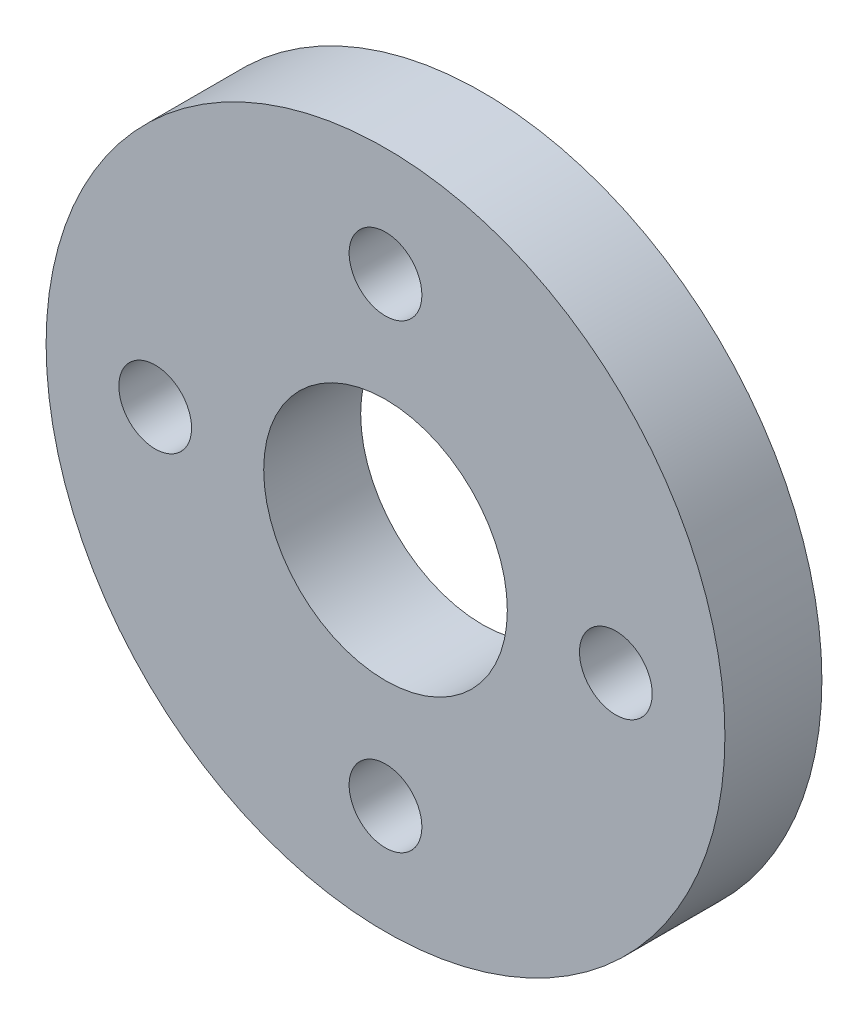
ISO-10303-21;
HEADER;
FILE_DESCRIPTION(('STEP AP214'),'2;1');
FILE_NAME('part.step','',(''),(''),'','','');
FILE_SCHEMA(('AUTOMOTIVE_DESIGN { 1 0 10303 214 1 1 1 1 }'));
ENDSEC;
DATA;
#1=APPLICATION_CONTEXT('core data for automotive mechanical design processes');
#2=APPLICATION_PROTOCOL_DEFINITION('international standard','automotive_design',2000,#1);
#3=PRODUCT_CONTEXT('',#1,'mechanical');
#4=PRODUCT('Part','Part','',(#3));
#5=PRODUCT_RELATED_PRODUCT_CATEGORY('part','',(#4));
#6=PRODUCT_DEFINITION_FORMATION('','',#4);
#7=PRODUCT_DEFINITION_CONTEXT('part definition',#1,'design');
#8=PRODUCT_DEFINITION('design','',#6,#7);
#9=PRODUCT_DEFINITION_SHAPE('','',#8);
#10=(LENGTH_UNIT() NAMED_UNIT(*) SI_UNIT(.MILLI.,.METRE.));
#11=(NAMED_UNIT(*) PLANE_ANGLE_UNIT() SI_UNIT($,.RADIAN.));
#12=(NAMED_UNIT(*) SI_UNIT($,.STERADIAN.) SOLID_ANGLE_UNIT());
#13=UNCERTAINTY_MEASURE_WITH_UNIT(LENGTH_MEASURE(1.E-05),#10,'distance_accuracy_value','');
#14=(GEOMETRIC_REPRESENTATION_CONTEXT(3) GLOBAL_UNCERTAINTY_ASSIGNED_CONTEXT((#13)) GLOBAL_UNIT_ASSIGNED_CONTEXT((#10,
#11,#12)) REPRESENTATION_CONTEXT('',''));
#15=CARTESIAN_POINT('',(0.,0.,0.));
#16=DIRECTION('',(0.,0.,1.));
#17=DIRECTION('',(1.,0.,0.));
#18=AXIS2_PLACEMENT_3D('',#15,#16,#17);
#19=CARTESIAN_POINT('',(0.,0.,4.));
#20=DIRECTION('',(0.,0.,1.));
#21=DIRECTION('',(1.,0.,0.));
#22=AXIS2_PLACEMENT_3D('',#19,#20,#21);
#23=PLANE('',#22);
#24=CARTESIAN_POINT('',(0.,9.5,4.));
#25=DIRECTION('',(0.,0.,1.));
#26=DIRECTION('',(1.,0.,0.));
#27=AXIS2_PLACEMENT_3D('',#24,#25,#26);
#28=CIRCLE('',#27,1.5);
#29=CARTESIAN_POINT('',(1.50000000000007,9.5,4.));
#30=VERTEX_POINT('',#29);
#31=EDGE_CURVE('E61',#30,#30,#28,.T.);
#32=ORIENTED_EDGE('',*,*,#31,.F.);
#33=EDGE_LOOP('',(#32));
#34=FACE_BOUND('',#33,.T.);
#35=CARTESIAN_POINT('',(0.,-9.5,4.));
#36=DIRECTION('',(0.,0.,1.));
#37=DIRECTION('',(1.,0.,0.));
#38=AXIS2_PLACEMENT_3D('',#35,#36,#37);
#39=CIRCLE('',#38,1.5);
#40=CARTESIAN_POINT('',(1.5,-9.5,4.));
#41=VERTEX_POINT('',#40);
#42=EDGE_CURVE('E49',#41,#41,#39,.T.);
#43=ORIENTED_EDGE('',*,*,#42,.F.);
#44=EDGE_LOOP('',(#43));
#45=FACE_BOUND('',#44,.T.);
#46=CARTESIAN_POINT('',(0.,0.,4.));
#47=DIRECTION('',(0.,0.,1.));
#48=DIRECTION('',(1.,0.,0.));
#49=AXIS2_PLACEMENT_3D('',#46,#47,#48);
#50=CIRCLE('',#49,14.);
#51=CARTESIAN_POINT('',(14.,0.,4.));
#52=VERTEX_POINT('',#51);
#53=EDGE_CURVE('E10',#52,#52,#50,.T.);
#54=ORIENTED_EDGE('',*,*,#53,.T.);
#55=EDGE_LOOP('',(#54));
#56=FACE_BOUND('',#55,.T.);
#57=CARTESIAN_POINT('',(0.,0.,4.));
#58=DIRECTION('',(0.,0.,1.));
#59=DIRECTION('',(1.,0.,0.));
#60=AXIS2_PLACEMENT_3D('',#57,#58,#59);
#61=CIRCLE('',#60,5.025);
#62=CARTESIAN_POINT('',(5.025,0.,4.));
#63=VERTEX_POINT('',#62);
#64=EDGE_CURVE('E44',#63,#63,#61,.T.);
#65=ORIENTED_EDGE('',*,*,#64,.F.);
#66=EDGE_LOOP('',(#65));
#67=FACE_BOUND('',#66,.T.);
#68=CARTESIAN_POINT('',(-9.5,1.66533453693773E-13,4.));
#69=DIRECTION('',(0.,0.,1.));
#70=DIRECTION('',(1.,0.,0.));
#71=AXIS2_PLACEMENT_3D('',#68,#69,#70);
#72=CIRCLE('',#71,1.5);
#73=CARTESIAN_POINT('',(-8.,1.66533453693773E-13,4.));
#74=VERTEX_POINT('',#73);
#75=EDGE_CURVE('E55',#74,#74,#72,.T.);
#76=ORIENTED_EDGE('',*,*,#75,.F.);
#77=EDGE_LOOP('',(#76));
#78=FACE_BOUND('',#77,.T.);
#79=CARTESIAN_POINT('',(9.5,0.,4.));
#80=DIRECTION('',(0.,0.,1.));
#81=DIRECTION('',(1.,0.,0.));
#82=AXIS2_PLACEMENT_3D('',#79,#80,#81);
#83=CIRCLE('',#82,1.5);
#84=CARTESIAN_POINT('',(11.,0.,4.));
#85=VERTEX_POINT('',#84);
#86=EDGE_CURVE('E67',#85,#85,#83,.T.);
#87=ORIENTED_EDGE('',*,*,#86,.F.);
#88=EDGE_LOOP('',(#87));
#89=FACE_BOUND('',#88,.T.);
#90=ADVANCED_FACE('F33',(#34,#45,#56,#67,#78,#89),#23,.T.);
#91=CARTESIAN_POINT('',(0.,0.,0.));
#92=DIRECTION('',(0.,0.,1.));
#93=DIRECTION('',(1.,0.,0.));
#94=AXIS2_PLACEMENT_3D('',#91,#92,#93);
#95=PLANE('',#94);
#96=CARTESIAN_POINT('',(0.,0.,0.));
#97=DIRECTION('',(0.,0.,1.));
#98=DIRECTION('',(1.,0.,0.));
#99=AXIS2_PLACEMENT_3D('',#96,#97,#98);
#100=CIRCLE('',#99,14.);
#101=CARTESIAN_POINT('',(14.,0.,0.));
#102=VERTEX_POINT('',#101);
#103=EDGE_CURVE('E37',#102,#102,#100,.T.);
#104=ORIENTED_EDGE('',*,*,#103,.F.);
#105=EDGE_LOOP('',(#104));
#106=FACE_BOUND('',#105,.T.);
#107=CARTESIAN_POINT('',(0.,0.,0.));
#108=DIRECTION('',(0.,0.,1.));
#109=DIRECTION('',(1.,0.,0.));
#110=AXIS2_PLACEMENT_3D('',#107,#108,#109);
#111=CIRCLE('',#110,5.025);
#112=CARTESIAN_POINT('',(5.025,0.,0.));
#113=VERTEX_POINT('',#112);
#114=EDGE_CURVE('E46',#113,#113,#111,.T.);
#115=ORIENTED_EDGE('',*,*,#114,.T.);
#116=EDGE_LOOP('',(#115));
#117=FACE_BOUND('',#116,.T.);
#118=CARTESIAN_POINT('',(0.,-9.5,0.));
#119=DIRECTION('',(0.,0.,1.));
#120=DIRECTION('',(1.,0.,0.));
#121=AXIS2_PLACEMENT_3D('',#118,#119,#120);
#122=CIRCLE('',#121,1.5);
#123=CARTESIAN_POINT('',(1.5,-9.5,0.));
#124=VERTEX_POINT('',#123);
#125=EDGE_CURVE('E52',#124,#124,#122,.T.);
#126=ORIENTED_EDGE('',*,*,#125,.T.);
#127=EDGE_LOOP('',(#126));
#128=FACE_BOUND('',#127,.T.);
#129=CARTESIAN_POINT('',(-9.5,1.66533453693773E-13,0.));
#130=DIRECTION('',(0.,0.,1.));
#131=DIRECTION('',(1.,0.,0.));
#132=AXIS2_PLACEMENT_3D('',#129,#130,#131);
#133=CIRCLE('',#132,1.5);
#134=CARTESIAN_POINT('',(-8.,1.66533453693773E-13,0.));
#135=VERTEX_POINT('',#134);
#136=EDGE_CURVE('E58',#135,#135,#133,.T.);
#137=ORIENTED_EDGE('',*,*,#136,.T.);
#138=EDGE_LOOP('',(#137));
#139=FACE_BOUND('',#138,.T.);
#140=CARTESIAN_POINT('',(0.,9.5,0.));
#141=DIRECTION('',(0.,0.,1.));
#142=DIRECTION('',(1.,0.,0.));
#143=AXIS2_PLACEMENT_3D('',#140,#141,#142);
#144=CIRCLE('',#143,1.5);
#145=CARTESIAN_POINT('',(1.50000000000007,9.5,0.));
#146=VERTEX_POINT('',#145);
#147=EDGE_CURVE('E64',#146,#146,#144,.T.);
#148=ORIENTED_EDGE('',*,*,#147,.T.);
#149=EDGE_LOOP('',(#148));
#150=FACE_BOUND('',#149,.T.);
#151=CARTESIAN_POINT('',(9.5,0.,0.));
#152=DIRECTION('',(0.,0.,1.));
#153=DIRECTION('',(1.,0.,0.));
#154=AXIS2_PLACEMENT_3D('',#151,#152,#153);
#155=CIRCLE('',#154,1.5);
#156=CARTESIAN_POINT('',(11.,0.,0.));
#157=VERTEX_POINT('',#156);
#158=EDGE_CURVE('E70',#157,#157,#155,.T.);
#159=ORIENTED_EDGE('',*,*,#158,.T.);
#160=EDGE_LOOP('',(#159));
#161=FACE_BOUND('',#160,.T.);
#162=ADVANCED_FACE('F80',(#106,#117,#128,#139,#150,#161),#95,.F.);
#163=CARTESIAN_POINT('',(0.,0.,4.));
#164=DIRECTION('',(0.,0.,-1.));
#165=DIRECTION('',(-1.,0.,0.));
#166=AXIS2_PLACEMENT_3D('',#163,#164,#165);
#167=CYLINDRICAL_SURFACE('',#166,14.);
#168=ORIENTED_EDGE('',*,*,#53,.F.);
#169=EDGE_LOOP('',(#168));
#170=FACE_BOUND('',#169,.T.);
#171=ORIENTED_EDGE('',*,*,#103,.T.);
#172=EDGE_LOOP('',(#171));
#173=FACE_BOUND('',#172,.T.);
#174=ADVANCED_FACE('F35',(#170,#173),#167,.T.);
#175=CARTESIAN_POINT('',(0.,0.,4.));
#176=DIRECTION('',(0.,0.,-1.));
#177=DIRECTION('',(-1.,0.,0.));
#178=AXIS2_PLACEMENT_3D('',#175,#176,#177);
#179=CYLINDRICAL_SURFACE('',#178,5.025);
#180=ORIENTED_EDGE('',*,*,#64,.T.);
#181=EDGE_LOOP('',(#180));
#182=FACE_BOUND('',#181,.T.);
#183=ORIENTED_EDGE('',*,*,#114,.F.);
#184=EDGE_LOOP('',(#183));
#185=FACE_BOUND('',#184,.T.);
#186=ADVANCED_FACE('F90',(#182,#185),#179,.F.);
#187=CARTESIAN_POINT('',(0.,-9.5,4.));
#188=DIRECTION('',(0.,0.,-1.));
#189=DIRECTION('',(-1.,0.,0.));
#190=AXIS2_PLACEMENT_3D('',#187,#188,#189);
#191=CYLINDRICAL_SURFACE('',#190,1.5);
#192=ORIENTED_EDGE('',*,*,#42,.T.);
#193=EDGE_LOOP('',(#192));
#194=FACE_BOUND('',#193,.T.);
#195=ORIENTED_EDGE('',*,*,#125,.F.);
#196=EDGE_LOOP('',(#195));
#197=FACE_BOUND('',#196,.T.);
#198=ADVANCED_FACE('F93',(#194,#197),#191,.F.);
#199=CARTESIAN_POINT('',(-9.5,1.66533453693773E-13,4.));
#200=DIRECTION('',(0.,0.,-1.));
#201=DIRECTION('',(-1.,0.,0.));
#202=AXIS2_PLACEMENT_3D('',#199,#200,#201);
#203=CYLINDRICAL_SURFACE('',#202,1.5);
#204=ORIENTED_EDGE('',*,*,#75,.T.);
#205=EDGE_LOOP('',(#204));
#206=FACE_BOUND('',#205,.T.);
#207=ORIENTED_EDGE('',*,*,#136,.F.);
#208=EDGE_LOOP('',(#207));
#209=FACE_BOUND('',#208,.T.);
#210=ADVANCED_FACE('F97',(#206,#209),#203,.F.);
#211=CARTESIAN_POINT('',(0.,9.5,4.));
#212=DIRECTION('',(0.,0.,-1.));
#213=DIRECTION('',(-1.,0.,0.));
#214=AXIS2_PLACEMENT_3D('',#211,#212,#213);
#215=CYLINDRICAL_SURFACE('',#214,1.5);
#216=ORIENTED_EDGE('',*,*,#31,.T.);
#217=EDGE_LOOP('',(#216));
#218=FACE_BOUND('',#217,.T.);
#219=ORIENTED_EDGE('',*,*,#147,.F.);
#220=EDGE_LOOP('',(#219));
#221=FACE_BOUND('',#220,.T.);
#222=ADVANCED_FACE('F101',(#218,#221),#215,.F.);
#223=CARTESIAN_POINT('',(9.5,0.,4.));
#224=DIRECTION('',(0.,0.,-1.));
#225=DIRECTION('',(-1.,0.,0.));
#226=AXIS2_PLACEMENT_3D('',#223,#224,#225);
#227=CYLINDRICAL_SURFACE('',#226,1.5);
#228=ORIENTED_EDGE('',*,*,#86,.T.);
#229=EDGE_LOOP('',(#228));
#230=FACE_BOUND('',#229,.T.);
#231=ORIENTED_EDGE('',*,*,#158,.F.);
#232=EDGE_LOOP('',(#231));
#233=FACE_BOUND('',#232,.T.);
#234=ADVANCED_FACE('F76',(#230,#233),#227,.F.);
#235=CLOSED_SHELL('',(#90,#162,#174,#186,#198,#210,#222,#234));
#236=MANIFOLD_SOLID_BREP('B2',#235);
#237=ADVANCED_BREP_SHAPE_REPRESENTATION('',(#18,#236),#14);
#238=SHAPE_DEFINITION_REPRESENTATION(#9,#237);
ENDSEC;
END-ISO-10303-21;
